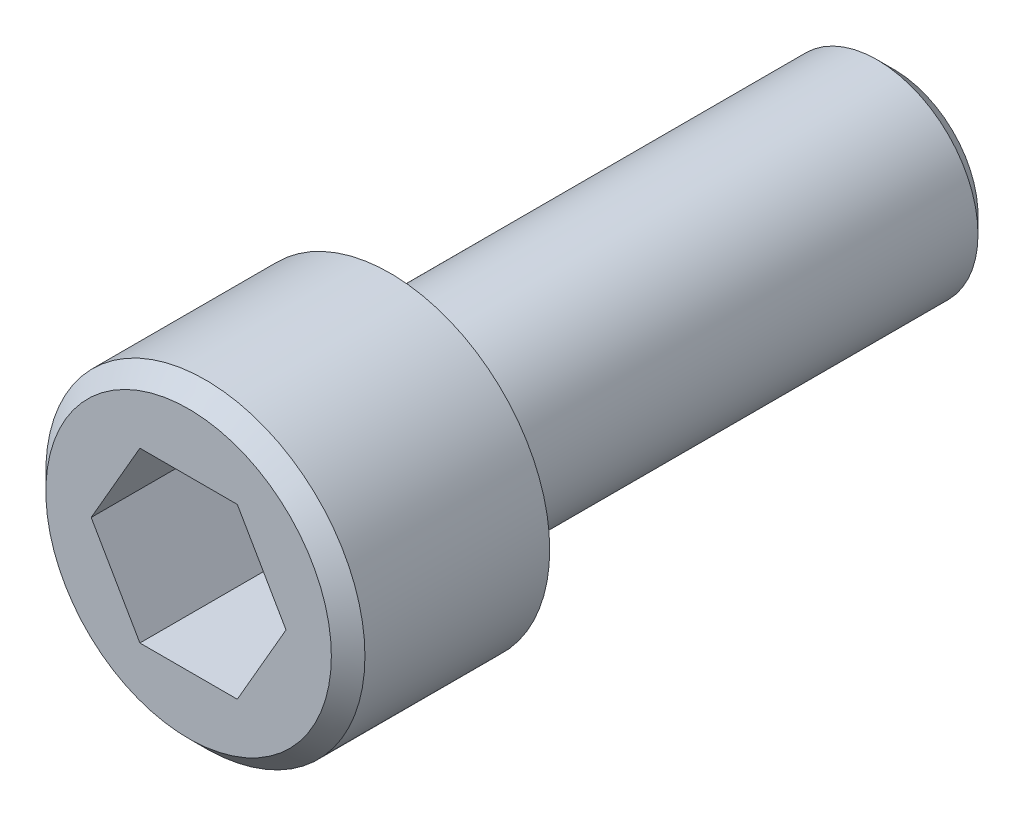
ISO-10303-21;
HEADER;
FILE_DESCRIPTION(('STEP AP214'),'2;1');
FILE_NAME('part.step','',(''),(''),'','','');
FILE_SCHEMA(('AUTOMOTIVE_DESIGN { 1 0 10303 214 1 1 1 1 }'));
ENDSEC;
DATA;
#1=APPLICATION_CONTEXT('core data for automotive mechanical design processes');
#2=APPLICATION_PROTOCOL_DEFINITION('international standard','automotive_design',2000,#1);
#3=PRODUCT_CONTEXT('',#1,'mechanical');
#4=PRODUCT('Part','Part','',(#3));
#5=PRODUCT_RELATED_PRODUCT_CATEGORY('part','',(#4));
#6=PRODUCT_DEFINITION_FORMATION('','',#4);
#7=PRODUCT_DEFINITION_CONTEXT('part definition',#1,'design');
#8=PRODUCT_DEFINITION('design','',#6,#7);
#9=PRODUCT_DEFINITION_SHAPE('','',#8);
#10=(LENGTH_UNIT() NAMED_UNIT(*) SI_UNIT(.MILLI.,.METRE.));
#11=(NAMED_UNIT(*) PLANE_ANGLE_UNIT() SI_UNIT($,.RADIAN.));
#12=(NAMED_UNIT(*) SI_UNIT($,.STERADIAN.) SOLID_ANGLE_UNIT());
#13=UNCERTAINTY_MEASURE_WITH_UNIT(LENGTH_MEASURE(1.E-05),#10,'distance_accuracy_value','');
#14=(GEOMETRIC_REPRESENTATION_CONTEXT(3) GLOBAL_UNCERTAINTY_ASSIGNED_CONTEXT((#13)) GLOBAL_UNIT_ASSIGNED_CONTEXT((#10,
#11,#12)) REPRESENTATION_CONTEXT('',''));
#15=CARTESIAN_POINT('',(0.,0.,0.));
#16=DIRECTION('',(0.,0.,1.));
#17=DIRECTION('',(1.,0.,0.));
#18=AXIS2_PLACEMENT_3D('',#15,#16,#17);
#19=CARTESIAN_POINT('',(0.,0.,0.));
#20=DIRECTION('',(0.,0.,1.));
#21=DIRECTION('',(1.,0.,0.));
#22=AXIS2_PLACEMENT_3D('',#19,#20,#21);
#23=PLANE('',#22);
#24=CARTESIAN_POINT('',(0.,0.,0.));
#25=DIRECTION('',(0.,0.,1.));
#26=DIRECTION('',(1.,0.,0.));
#27=AXIS2_PLACEMENT_3D('',#24,#25,#26);
#28=CIRCLE('',#27,9.5);
#29=CARTESIAN_POINT('',(9.5,0.,0.));
#30=VERTEX_POINT('',#29);
#31=EDGE_CURVE('E135',#30,#30,#28,.T.);
#32=ORIENTED_EDGE('',*,*,#31,.F.);
#33=EDGE_LOOP('',(#32));
#34=FACE_BOUND('',#33,.T.);
#35=CARTESIAN_POINT('',(0.,0.,0.));
#36=DIRECTION('',(0.,0.,1.));
#37=DIRECTION('',(1.,0.,0.));
#38=AXIS2_PLACEMENT_3D('',#35,#36,#37);
#39=CIRCLE('',#38,6.);
#40=CARTESIAN_POINT('',(6.,0.,0.));
#41=VERTEX_POINT('',#40);
#42=EDGE_CURVE('E143',#41,#41,#39,.F.);
#43=ORIENTED_EDGE('',*,*,#42,.F.);
#44=EDGE_LOOP('',(#43));
#45=FACE_BOUND('',#44,.T.);
#46=ADVANCED_FACE('F33',(#34,#45),#23,.F.);
#47=CARTESIAN_POINT('',(0.,0.,12.));
#48=DIRECTION('',(0.,0.,-1.));
#49=DIRECTION('',(-1.,0.,0.));
#50=AXIS2_PLACEMENT_3D('',#47,#48,#49);
#51=CYLINDRICAL_SURFACE('',#50,9.5);
#52=CARTESIAN_POINT('',(0.,0.,11.));
#53=DIRECTION('',(0.,0.,1.));
#54=DIRECTION('',(1.,0.,0.));
#55=AXIS2_PLACEMENT_3D('',#52,#53,#54);
#56=CIRCLE('',#55,9.5);
#57=CARTESIAN_POINT('',(9.5,0.,11.));
#58=VERTEX_POINT('',#57);
#59=EDGE_CURVE('E149',#58,#58,#56,.F.);
#60=ORIENTED_EDGE('',*,*,#59,.T.);
#61=EDGE_LOOP('',(#60));
#62=FACE_BOUND('',#61,.T.);
#63=ORIENTED_EDGE('',*,*,#31,.T.);
#64=EDGE_LOOP('',(#63));
#65=FACE_BOUND('',#64,.T.);
#66=ADVANCED_FACE('F169',(#62,#65),#51,.T.);
#67=CARTESIAN_POINT('',(0.,0.,12.));
#68=DIRECTION('',(0.,0.,1.));
#69=DIRECTION('',(1.,0.,0.));
#70=AXIS2_PLACEMENT_3D('',#67,#68,#69);
#71=PLANE('',#70);
#72=DIRECTION('',(0.5,0.866025403784439,0.));
#73=VECTOR('',#72,1.);
#74=CARTESIAN_POINT('',(2.9,-5.02294734194975,12.));
#75=LINE('',#74,#73);
#76=CARTESIAN_POINT('',(2.9,-5.02294734194975,12.));
#77=VERTEX_POINT('',#76);
#78=CARTESIAN_POINT('',(5.8,0.,12.));
#79=VERTEX_POINT('',#78);
#80=EDGE_CURVE('E48',#77,#79,#75,.T.);
#81=ORIENTED_EDGE('',*,*,#80,.F.);
#82=DIRECTION('',(1.,0.,0.));
#83=VECTOR('',#82,1.);
#84=CARTESIAN_POINT('',(-2.9,-5.02294734194975,12.));
#85=LINE('',#84,#83);
#86=CARTESIAN_POINT('',(-2.9,-5.02294734194975,12.));
#87=VERTEX_POINT('',#86);
#88=EDGE_CURVE('E131',#87,#77,#85,.T.);
#89=ORIENTED_EDGE('',*,*,#88,.F.);
#90=DIRECTION('',(0.5,-0.866025403784439,0.));
#91=VECTOR('',#90,1.);
#92=CARTESIAN_POINT('',(-5.8,0.,12.));
#93=LINE('',#92,#91);
#94=CARTESIAN_POINT('',(-5.8,0.,12.));
#95=VERTEX_POINT('',#94);
#96=EDGE_CURVE('E129',#95,#87,#93,.T.);
#97=ORIENTED_EDGE('',*,*,#96,.F.);
#98=DIRECTION('',(-0.5,-0.866025403784439,0.));
#99=VECTOR('',#98,1.);
#100=CARTESIAN_POINT('',(-2.9,5.02294734194975,12.));
#101=LINE('',#100,#99);
#102=CARTESIAN_POINT('',(-2.9,5.02294734194975,12.));
#103=VERTEX_POINT('',#102);
#104=EDGE_CURVE('E96',#103,#95,#101,.T.);
#105=ORIENTED_EDGE('',*,*,#104,.F.);
#106=DIRECTION('',(-1.,0.,0.));
#107=VECTOR('',#106,1.);
#108=CARTESIAN_POINT('',(2.9,5.02294734194975,12.));
#109=LINE('',#108,#107);
#110=CARTESIAN_POINT('',(2.9,5.02294734194975,12.));
#111=VERTEX_POINT('',#110);
#112=EDGE_CURVE('E125',#111,#103,#109,.T.);
#113=ORIENTED_EDGE('',*,*,#112,.F.);
#114=DIRECTION('',(-0.5,0.866025403784439,0.));
#115=VECTOR('',#114,1.);
#116=CARTESIAN_POINT('',(5.8,0.,12.));
#117=LINE('',#116,#115);
#118=EDGE_CURVE('E122',#79,#111,#117,.T.);
#119=ORIENTED_EDGE('',*,*,#118,.F.);
#120=EDGE_LOOP('',(#81,#89,#97,#105,#113,#119));
#121=FACE_BOUND('',#120,.T.);
#122=CARTESIAN_POINT('',(0.,0.,12.));
#123=DIRECTION('',(0.,0.,1.));
#124=DIRECTION('',(1.,0.,0.));
#125=AXIS2_PLACEMENT_3D('',#122,#123,#124);
#126=CIRCLE('',#125,8.49999999999999);
#127=CARTESIAN_POINT('',(8.49999999999999,0.,12.));
#128=VERTEX_POINT('',#127);
#129=EDGE_CURVE('E146',#128,#128,#126,.T.);
#130=ORIENTED_EDGE('',*,*,#129,.T.);
#131=EDGE_LOOP('',(#130));
#132=FACE_BOUND('',#131,.T.);
#133=ADVANCED_FACE('F175',(#121,#132),#71,.T.);
#134=CARTESIAN_POINT('',(0.,0.,-30.));
#135=DIRECTION('',(0.,0.,1.));
#136=DIRECTION('',(1.,0.,0.));
#137=AXIS2_PLACEMENT_3D('',#134,#135,#136);
#138=CYLINDRICAL_SURFACE('',#137,6.);
#139=CARTESIAN_POINT('',(0.,0.,-29.));
#140=DIRECTION('',(0.,0.,-1.));
#141=DIRECTION('',(-1.,0.,0.));
#142=AXIS2_PLACEMENT_3D('',#139,#140,#141);
#143=CIRCLE('',#142,6.);
#144=CARTESIAN_POINT('',(-6.,0.,-29.));
#145=VERTEX_POINT('',#144);
#146=EDGE_CURVE('E11',#145,#145,#143,.F.);
#147=ORIENTED_EDGE('',*,*,#146,.T.);
#148=EDGE_LOOP('',(#147));
#149=FACE_BOUND('',#148,.T.);
#150=ORIENTED_EDGE('',*,*,#42,.T.);
#151=EDGE_LOOP('',(#150));
#152=FACE_BOUND('',#151,.T.);
#153=ADVANCED_FACE('F183',(#149,#152),#138,.T.);
#154=CARTESIAN_POINT('',(0.,0.,-30.));
#155=DIRECTION('',(0.,0.,-1.));
#156=DIRECTION('',(-1.,0.,0.));
#157=AXIS2_PLACEMENT_3D('',#154,#155,#156);
#158=PLANE('',#157);
#159=CARTESIAN_POINT('',(0.,0.,-30.));
#160=DIRECTION('',(0.,0.,-1.));
#161=DIRECTION('',(-1.,0.,0.));
#162=AXIS2_PLACEMENT_3D('',#159,#160,#161);
#163=CIRCLE('',#162,5.);
#164=CARTESIAN_POINT('',(-5.,0.,-30.));
#165=VERTEX_POINT('',#164);
#166=EDGE_CURVE('E41',#165,#165,#163,.T.);
#167=ORIENTED_EDGE('',*,*,#166,.T.);
#168=EDGE_LOOP('',(#167));
#169=FACE_BOUND('',#168,.T.);
#170=ADVANCED_FACE('F154',(#169),#158,.T.);
#171=CARTESIAN_POINT('',(0.,0.,12.));
#172=DIRECTION('',(0.,0.,-1.));
#173=DIRECTION('',(-1.,0.,0.));
#174=AXIS2_PLACEMENT_3D('',#171,#172,#173);
#175=CONICAL_SURFACE('',#174,8.49999999999999,0.78539816339745);
#176=ORIENTED_EDGE('',*,*,#59,.F.);
#177=EDGE_LOOP('',(#176));
#178=FACE_BOUND('',#177,.T.);
#179=ORIENTED_EDGE('',*,*,#129,.F.);
#180=EDGE_LOOP('',(#179));
#181=FACE_BOUND('',#180,.T.);
#182=ADVANCED_FACE('F158',(#178,#181),#175,.T.);
#183=CARTESIAN_POINT('',(0.,0.,-30.));
#184=DIRECTION('',(0.,0.,1.));
#185=DIRECTION('',(1.,0.,0.));
#186=AXIS2_PLACEMENT_3D('',#183,#184,#185);
#187=CONICAL_SURFACE('',#186,5.,0.785398163397445);
#188=ORIENTED_EDGE('',*,*,#146,.F.);
#189=EDGE_LOOP('',(#188));
#190=FACE_BOUND('',#189,.T.);
#191=ORIENTED_EDGE('',*,*,#166,.F.);
#192=EDGE_LOOP('',(#191));
#193=FACE_BOUND('',#192,.T.);
#194=ADVANCED_FACE('F35',(#190,#193),#187,.T.);
#195=CARTESIAN_POINT('',(2.9,-5.02294734194975,4.));
#196=DIRECTION('',(0.866025403784439,-0.5,0.));
#197=DIRECTION('',(0.5,0.866025403784439,0.));
#198=AXIS2_PLACEMENT_3D('',#195,#196,#197);
#199=PLANE('',#198);
#200=ORIENTED_EDGE('',*,*,#80,.T.);
#201=DIRECTION('',(0.,0.,1.));
#202=VECTOR('',#201,1.);
#203=CARTESIAN_POINT('',(5.8,0.,4.));
#204=LINE('',#203,#202);
#205=CARTESIAN_POINT('',(5.8,0.,4.));
#206=VERTEX_POINT('',#205);
#207=EDGE_CURVE('E78',#206,#79,#204,.T.);
#208=ORIENTED_EDGE('',*,*,#207,.F.);
#209=DIRECTION('',(0.5,0.866025403784439,0.));
#210=VECTOR('',#209,1.);
#211=CARTESIAN_POINT('',(2.9,-5.02294734194975,4.));
#212=LINE('',#211,#210);
#213=CARTESIAN_POINT('',(2.9,-5.02294734194975,4.));
#214=VERTEX_POINT('',#213);
#215=EDGE_CURVE('E133',#214,#206,#212,.T.);
#216=ORIENTED_EDGE('',*,*,#215,.F.);
#217=DIRECTION('',(0.,0.,1.));
#218=VECTOR('',#217,1.);
#219=CARTESIAN_POINT('',(2.9,-5.02294734194975,4.));
#220=LINE('',#219,#218);
#221=EDGE_CURVE('E56',#214,#77,#220,.T.);
#222=ORIENTED_EDGE('',*,*,#221,.T.);
#223=EDGE_LOOP('',(#200,#208,#216,#222));
#224=FACE_BOUND('',#223,.T.);
#225=ADVANCED_FACE('F157',(#224),#199,.F.);
#226=CARTESIAN_POINT('',(-2.9,-5.02294734194975,4.));
#227=DIRECTION('',(0.,-1.,0.));
#228=DIRECTION('',(1.,0.,0.));
#229=AXIS2_PLACEMENT_3D('',#226,#227,#228);
#230=PLANE('',#229);
#231=ORIENTED_EDGE('',*,*,#88,.T.);
#232=ORIENTED_EDGE('',*,*,#221,.F.);
#233=DIRECTION('',(1.,0.,0.));
#234=VECTOR('',#233,1.);
#235=CARTESIAN_POINT('',(-2.9,-5.02294734194975,4.));
#236=LINE('',#235,#234);
#237=CARTESIAN_POINT('',(-2.9,-5.02294734194975,4.));
#238=VERTEX_POINT('',#237);
#239=EDGE_CURVE('E108',#238,#214,#236,.T.);
#240=ORIENTED_EDGE('',*,*,#239,.F.);
#241=DIRECTION('',(0.,0.,1.));
#242=VECTOR('',#241,1.);
#243=CARTESIAN_POINT('',(-2.9,-5.02294734194975,4.));
#244=LINE('',#243,#242);
#245=EDGE_CURVE('E100',#238,#87,#244,.T.);
#246=ORIENTED_EDGE('',*,*,#245,.T.);
#247=EDGE_LOOP('',(#231,#232,#240,#246));
#248=FACE_BOUND('',#247,.T.);
#249=ADVANCED_FACE('F164',(#248),#230,.F.);
#250=CARTESIAN_POINT('',(-5.8,0.,4.));
#251=DIRECTION('',(-0.866025403784439,-0.5,0.));
#252=DIRECTION('',(0.5,-0.866025403784439,0.));
#253=AXIS2_PLACEMENT_3D('',#250,#251,#252);
#254=PLANE('',#253);
#255=ORIENTED_EDGE('',*,*,#96,.T.);
#256=ORIENTED_EDGE('',*,*,#245,.F.);
#257=DIRECTION('',(0.5,-0.866025403784439,0.));
#258=VECTOR('',#257,1.);
#259=CARTESIAN_POINT('',(-5.8,0.,4.));
#260=LINE('',#259,#258);
#261=CARTESIAN_POINT('',(-5.8,0.,4.));
#262=VERTEX_POINT('',#261);
#263=EDGE_CURVE('E104',#262,#238,#260,.T.);
#264=ORIENTED_EDGE('',*,*,#263,.F.);
#265=DIRECTION('',(0.,0.,1.));
#266=VECTOR('',#265,1.);
#267=CARTESIAN_POINT('',(-5.8,0.,4.));
#268=LINE('',#267,#266);
#269=EDGE_CURVE('E89',#262,#95,#268,.T.);
#270=ORIENTED_EDGE('',*,*,#269,.T.);
#271=EDGE_LOOP('',(#255,#256,#264,#270));
#272=FACE_BOUND('',#271,.T.);
#273=ADVANCED_FACE('F105',(#272),#254,.F.);
#274=CARTESIAN_POINT('',(-2.9,5.02294734194975,4.));
#275=DIRECTION('',(-0.866025403784439,0.5,0.));
#276=DIRECTION('',(-0.5,-0.866025403784439,0.));
#277=AXIS2_PLACEMENT_3D('',#274,#275,#276);
#278=PLANE('',#277);
#279=ORIENTED_EDGE('',*,*,#104,.T.);
#280=ORIENTED_EDGE('',*,*,#269,.F.);
#281=DIRECTION('',(-0.5,-0.866025403784439,0.));
#282=VECTOR('',#281,1.);
#283=CARTESIAN_POINT('',(-2.9,5.02294734194975,4.));
#284=LINE('',#283,#282);
#285=CARTESIAN_POINT('',(-2.9,5.02294734194975,4.));
#286=VERTEX_POINT('',#285);
#287=EDGE_CURVE('E93',#286,#262,#284,.T.);
#288=ORIENTED_EDGE('',*,*,#287,.F.);
#289=DIRECTION('',(0.,0.,1.));
#290=VECTOR('',#289,1.);
#291=CARTESIAN_POINT('',(-2.9,5.02294734194975,4.));
#292=LINE('',#291,#290);
#293=EDGE_CURVE('E101',#286,#103,#292,.T.);
#294=ORIENTED_EDGE('',*,*,#293,.T.);
#295=EDGE_LOOP('',(#279,#280,#288,#294));
#296=FACE_BOUND('',#295,.T.);
#297=ADVANCED_FACE('F91',(#296),#278,.F.);
#298=CARTESIAN_POINT('',(2.9,5.02294734194975,4.));
#299=DIRECTION('',(0.,1.,0.));
#300=DIRECTION('',(0.,0.,1.));
#301=AXIS2_PLACEMENT_3D('',#298,#299,#300);
#302=PLANE('',#301);
#303=ORIENTED_EDGE('',*,*,#112,.T.);
#304=ORIENTED_EDGE('',*,*,#293,.F.);
#305=DIRECTION('',(-1.,0.,0.));
#306=VECTOR('',#305,1.);
#307=CARTESIAN_POINT('',(2.9,5.02294734194975,4.));
#308=LINE('',#307,#306);
#309=CARTESIAN_POINT('',(2.9,5.02294734194975,4.));
#310=VERTEX_POINT('',#309);
#311=EDGE_CURVE('E114',#310,#286,#308,.T.);
#312=ORIENTED_EDGE('',*,*,#311,.F.);
#313=DIRECTION('',(0.,0.,1.));
#314=VECTOR('',#313,1.);
#315=CARTESIAN_POINT('',(2.9,5.02294734194975,4.));
#316=LINE('',#315,#314);
#317=EDGE_CURVE('E138',#310,#111,#316,.T.);
#318=ORIENTED_EDGE('',*,*,#317,.T.);
#319=EDGE_LOOP('',(#303,#304,#312,#318));
#320=FACE_BOUND('',#319,.T.);
#321=ADVANCED_FACE('F193',(#320),#302,.F.);
#322=CARTESIAN_POINT('',(5.8,0.,4.));
#323=DIRECTION('',(0.866025403784439,0.5,0.));
#324=DIRECTION('',(-0.5,0.866025403784439,0.));
#325=AXIS2_PLACEMENT_3D('',#322,#323,#324);
#326=PLANE('',#325);
#327=ORIENTED_EDGE('',*,*,#118,.T.);
#328=ORIENTED_EDGE('',*,*,#317,.F.);
#329=DIRECTION('',(-0.5,0.866025403784439,0.));
#330=VECTOR('',#329,1.);
#331=CARTESIAN_POINT('',(5.8,0.,4.));
#332=LINE('',#331,#330);
#333=EDGE_CURVE('E116',#206,#310,#332,.T.);
#334=ORIENTED_EDGE('',*,*,#333,.F.);
#335=ORIENTED_EDGE('',*,*,#207,.T.);
#336=EDGE_LOOP('',(#327,#328,#334,#335));
#337=FACE_BOUND('',#336,.T.);
#338=ADVANCED_FACE('F190',(#337),#326,.F.);
#339=CARTESIAN_POINT('',(0.,0.,4.));
#340=DIRECTION('',(0.,0.,1.));
#341=DIRECTION('',(1.,0.,0.));
#342=AXIS2_PLACEMENT_3D('',#339,#340,#341);
#343=PLANE('',#342);
#344=ORIENTED_EDGE('',*,*,#215,.T.);
#345=ORIENTED_EDGE('',*,*,#333,.T.);
#346=ORIENTED_EDGE('',*,*,#311,.T.);
#347=ORIENTED_EDGE('',*,*,#287,.T.);
#348=ORIENTED_EDGE('',*,*,#263,.T.);
#349=ORIENTED_EDGE('',*,*,#239,.T.);
#350=EDGE_LOOP('',(#344,#345,#346,#347,#348,#349));
#351=FACE_BOUND('',#350,.T.);
#352=ADVANCED_FACE('F111',(#351),#343,.T.);
#353=CLOSED_SHELL('',(#46,#66,#133,#153,#170,#182,#194,#225,#249,#273,#297,#321,#338,#352));
#354=MANIFOLD_SOLID_BREP('B2',#353);
#355=ADVANCED_BREP_SHAPE_REPRESENTATION('',(#18,#354),#14);
#356=SHAPE_DEFINITION_REPRESENTATION(#9,#355);
ENDSEC;
END-ISO-10303-21;
